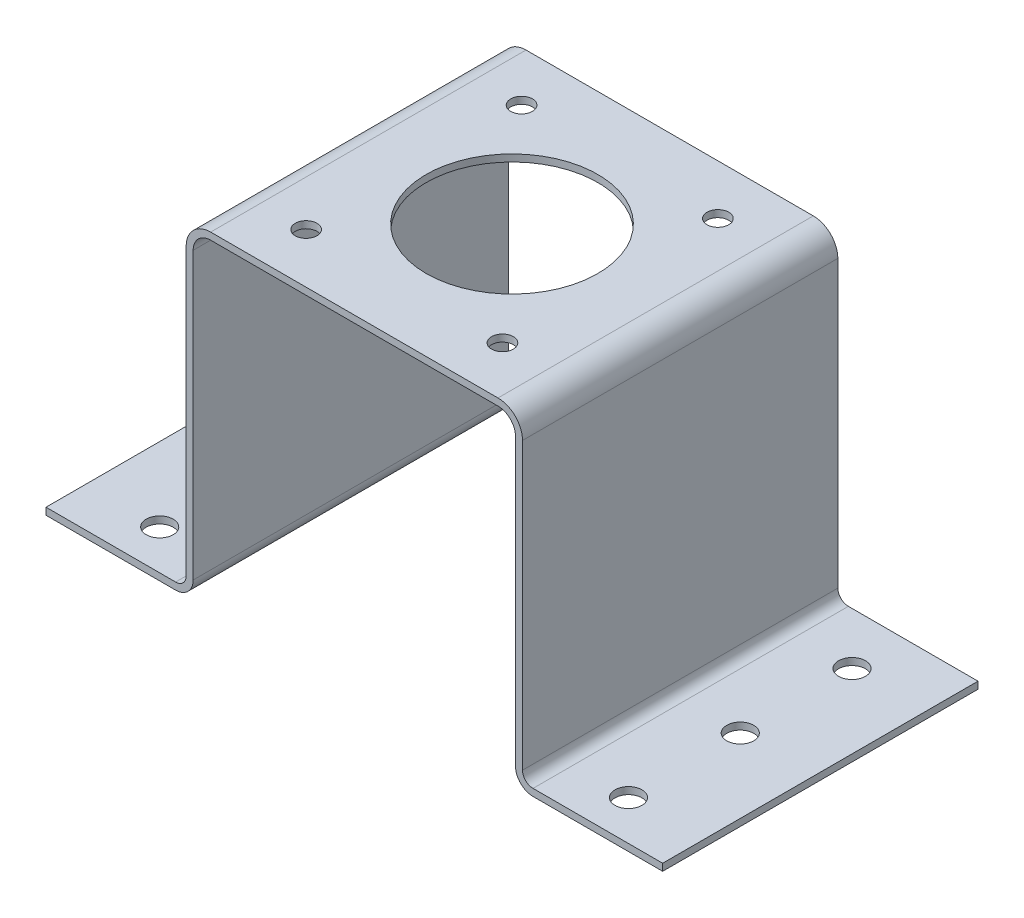
ISO-10303-21;
HEADER;
FILE_DESCRIPTION(('STEP AP214'),'2;1');
FILE_NAME('part.step','',(''),(''),'','','');
FILE_SCHEMA(('AUTOMOTIVE_DESIGN { 1 0 10303 214 1 1 1 1 }'));
ENDSEC;
DATA;
#1=APPLICATION_CONTEXT('core data for automotive mechanical design processes');
#2=APPLICATION_PROTOCOL_DEFINITION('international standard','automotive_design',2000,#1);
#3=PRODUCT_CONTEXT('',#1,'mechanical');
#4=PRODUCT('Part','Part','',(#3));
#5=PRODUCT_RELATED_PRODUCT_CATEGORY('part','',(#4));
#6=PRODUCT_DEFINITION_FORMATION('','',#4);
#7=PRODUCT_DEFINITION_CONTEXT('part definition',#1,'design');
#8=PRODUCT_DEFINITION('design','',#6,#7);
#9=PRODUCT_DEFINITION_SHAPE('','',#8);
#10=(LENGTH_UNIT() NAMED_UNIT(*) SI_UNIT(.MILLI.,.METRE.));
#11=(NAMED_UNIT(*) PLANE_ANGLE_UNIT() SI_UNIT($,.RADIAN.));
#12=(NAMED_UNIT(*) SI_UNIT($,.STERADIAN.) SOLID_ANGLE_UNIT());
#13=UNCERTAINTY_MEASURE_WITH_UNIT(LENGTH_MEASURE(1.E-05),#10,'distance_accuracy_value','');
#14=(GEOMETRIC_REPRESENTATION_CONTEXT(3) GLOBAL_UNCERTAINTY_ASSIGNED_CONTEXT((#13)) GLOBAL_UNIT_ASSIGNED_CONTEXT((#10,
#11,#12)) REPRESENTATION_CONTEXT('',''));
#15=CARTESIAN_POINT('',(0.,0.,0.));
#16=DIRECTION('',(0.,0.,1.));
#17=DIRECTION('',(1.,0.,0.));
#18=AXIS2_PLACEMENT_3D('',#15,#16,#17);
#19=CARTESIAN_POINT('',(18.796,2.54,45.72));
#20=DIRECTION('',(0.,0.,-1.));
#21=DIRECTION('',(-1.,0.,0.));
#22=AXIS2_PLACEMENT_3D('',#19,#20,#21);
#23=CYLINDRICAL_SURFACE('',#22,1.524);
#24=CARTESIAN_POINT('',(18.796,2.54,0.));
#25=DIRECTION('',(0.,0.,1.));
#26=DIRECTION('',(1.,0.,0.));
#27=AXIS2_PLACEMENT_3D('',#24,#25,#26);
#28=CIRCLE('',#27,1.524);
#29=CARTESIAN_POINT('',(18.796,1.016,0.));
#30=VERTEX_POINT('',#29);
#31=CARTESIAN_POINT('',(20.32,2.54000000000001,0.));
#32=VERTEX_POINT('',#31);
#33=EDGE_CURVE('E200',#30,#32,#28,.T.);
#34=ORIENTED_EDGE('',*,*,#33,.F.);
#35=DIRECTION('',(0.,0.,-1.));
#36=VECTOR('',#35,1.);
#37=CARTESIAN_POINT('',(18.796,1.016,45.72));
#38=LINE('',#37,#36);
#39=CARTESIAN_POINT('',(18.796,1.016,45.72));
#40=VERTEX_POINT('',#39);
#41=EDGE_CURVE('E11',#40,#30,#38,.T.);
#42=ORIENTED_EDGE('',*,*,#41,.F.);
#43=CARTESIAN_POINT('',(18.796,2.54,45.72));
#44=DIRECTION('',(0.,0.,1.));
#45=DIRECTION('',(1.,0.,0.));
#46=AXIS2_PLACEMENT_3D('',#43,#44,#45);
#47=CIRCLE('',#46,1.524);
#48=CARTESIAN_POINT('',(20.32,2.54000000000001,45.72));
#49=VERTEX_POINT('',#48);
#50=EDGE_CURVE('E249',#40,#49,#47,.T.);
#51=ORIENTED_EDGE('',*,*,#50,.T.);
#52=DIRECTION('',(0.,0.,-1.));
#53=VECTOR('',#52,1.);
#54=CARTESIAN_POINT('',(20.32,2.54000000000001,45.72));
#55=LINE('',#54,#53);
#56=EDGE_CURVE('E125',#49,#32,#55,.T.);
#57=ORIENTED_EDGE('',*,*,#56,.T.);
#58=EDGE_LOOP('',(#34,#42,#51,#57));
#59=FACE_BOUND('',#58,.T.);
#60=ADVANCED_FACE('F33',(#59),#23,.F.);
#61=CARTESIAN_POINT('',(0.,1.016,45.72));
#62=DIRECTION('',(0.,1.,0.));
#63=DIRECTION('',(0.,0.,1.));
#64=AXIS2_PLACEMENT_3D('',#61,#62,#63);
#65=PLANE('',#64);
#66=CARTESIAN_POINT('',(10.7188,1.016,23.749));
#67=DIRECTION('',(0.,1.,0.));
#68=DIRECTION('',(0.,0.,1.));
#69=AXIS2_PLACEMENT_3D('',#66,#67,#68);
#70=CIRCLE('',#69,1.9558);
#71=CARTESIAN_POINT('',(10.7188,1.016,25.7048));
#72=VERTEX_POINT('',#71);
#73=EDGE_CURVE('E298',#72,#72,#70,.T.);
#74=ORIENTED_EDGE('',*,*,#73,.F.);
#75=EDGE_LOOP('',(#74));
#76=FACE_BOUND('',#75,.T.);
#77=CARTESIAN_POINT('',(10.7188,1.016,39.9542));
#78=DIRECTION('',(0.,1.,0.));
#79=DIRECTION('',(0.,0.,1.));
#80=AXIS2_PLACEMENT_3D('',#77,#78,#79);
#81=CIRCLE('',#80,1.9558);
#82=CARTESIAN_POINT('',(10.7188,1.016,41.91));
#83=VERTEX_POINT('',#82);
#84=EDGE_CURVE('E303',#83,#83,#81,.T.);
#85=ORIENTED_EDGE('',*,*,#84,.F.);
#86=EDGE_LOOP('',(#85));
#87=FACE_BOUND('',#86,.T.);
#88=CARTESIAN_POINT('',(10.7188,1.016,7.5438));
#89=DIRECTION('',(0.,1.,0.));
#90=DIRECTION('',(0.,0.,1.));
#91=AXIS2_PLACEMENT_3D('',#88,#89,#90);
#92=CIRCLE('',#91,1.9558);
#93=CARTESIAN_POINT('',(10.7188,1.016,9.4996));
#94=VERTEX_POINT('',#93);
#95=EDGE_CURVE('E295',#94,#94,#92,.T.);
#96=ORIENTED_EDGE('',*,*,#95,.F.);
#97=EDGE_LOOP('',(#96));
#98=FACE_BOUND('',#97,.T.);
#99=DIRECTION('',(1.,0.,0.));
#100=VECTOR('',#99,1.);
#101=CARTESIAN_POINT('',(0.,1.016,0.));
#102=LINE('',#101,#100);
#103=CARTESIAN_POINT('',(0.,1.016,0.));
#104=VERTEX_POINT('',#103);
#105=EDGE_CURVE('E247',#104,#30,#102,.T.);
#106=ORIENTED_EDGE('',*,*,#105,.F.);
#107=DIRECTION('',(0.,0.,-1.));
#108=VECTOR('',#107,1.);
#109=CARTESIAN_POINT('',(0.,1.016,45.72));
#110=LINE('',#109,#108);
#111=CARTESIAN_POINT('',(0.,1.016,45.72));
#112=VERTEX_POINT('',#111);
#113=EDGE_CURVE('E42',#112,#104,#110,.T.);
#114=ORIENTED_EDGE('',*,*,#113,.F.);
#115=DIRECTION('',(1.,0.,0.));
#116=VECTOR('',#115,1.);
#117=CARTESIAN_POINT('',(0.,1.016,45.72));
#118=LINE('',#117,#116);
#119=EDGE_CURVE('E195',#112,#40,#118,.T.);
#120=ORIENTED_EDGE('',*,*,#119,.T.);
#121=ORIENTED_EDGE('',*,*,#41,.T.);
#122=EDGE_LOOP('',(#106,#114,#120,#121));
#123=FACE_BOUND('',#122,.T.);
#124=ADVANCED_FACE('F449',(#76,#87,#98,#123),#65,.T.);
#125=CARTESIAN_POINT('',(0.,0.,45.72));
#126=DIRECTION('',(-1.,0.,0.));
#127=DIRECTION('',(0.,0.,1.));
#128=AXIS2_PLACEMENT_3D('',#125,#126,#127);
#129=PLANE('',#128);
#130=DIRECTION('',(0.,1.,0.));
#131=VECTOR('',#130,1.);
#132=CARTESIAN_POINT('',(0.,0.,0.));
#133=LINE('',#132,#131);
#134=CARTESIAN_POINT('',(0.,0.,0.));
#135=VERTEX_POINT('',#134);
#136=EDGE_CURVE('E181',#135,#104,#133,.T.);
#137=ORIENTED_EDGE('',*,*,#136,.F.);
#138=DIRECTION('',(0.,0.,-1.));
#139=VECTOR('',#138,1.);
#140=CARTESIAN_POINT('',(0.,0.,45.72));
#141=LINE('',#140,#139);
#142=CARTESIAN_POINT('',(0.,0.,45.72));
#143=VERTEX_POINT('',#142);
#144=EDGE_CURVE('E175',#143,#135,#141,.T.);
#145=ORIENTED_EDGE('',*,*,#144,.F.);
#146=DIRECTION('',(0.,1.,0.));
#147=VECTOR('',#146,1.);
#148=CARTESIAN_POINT('',(0.,0.,45.72));
#149=LINE('',#148,#147);
#150=EDGE_CURVE('E179',#143,#112,#149,.T.);
#151=ORIENTED_EDGE('',*,*,#150,.T.);
#152=ORIENTED_EDGE('',*,*,#113,.T.);
#153=EDGE_LOOP('',(#137,#145,#151,#152));
#154=FACE_BOUND('',#153,.T.);
#155=ADVANCED_FACE('F177',(#154),#129,.T.);
#156=CARTESIAN_POINT('',(0.,0.,45.72));
#157=DIRECTION('',(0.,1.,0.));
#158=DIRECTION('',(0.,0.,1.));
#159=AXIS2_PLACEMENT_3D('',#156,#157,#158);
#160=PLANE('',#159);
#161=CARTESIAN_POINT('',(10.7188,0.,23.749));
#162=DIRECTION('',(0.,1.,0.));
#163=DIRECTION('',(0.,0.,1.));
#164=AXIS2_PLACEMENT_3D('',#161,#162,#163);
#165=CIRCLE('',#164,1.9558);
#166=CARTESIAN_POINT('',(10.7188,0.,25.7048));
#167=VERTEX_POINT('',#166);
#168=EDGE_CURVE('E36',#167,#167,#165,.T.);
#169=ORIENTED_EDGE('',*,*,#168,.T.);
#170=EDGE_LOOP('',(#169));
#171=FACE_BOUND('',#170,.T.);
#172=CARTESIAN_POINT('',(10.7188,0.,39.9542));
#173=DIRECTION('',(0.,1.,0.));
#174=DIRECTION('',(0.,0.,1.));
#175=AXIS2_PLACEMENT_3D('',#172,#173,#174);
#176=CIRCLE('',#175,1.9558);
#177=CARTESIAN_POINT('',(10.7188,0.,41.91));
#178=VERTEX_POINT('',#177);
#179=EDGE_CURVE('E296',#178,#178,#176,.T.);
#180=ORIENTED_EDGE('',*,*,#179,.T.);
#181=EDGE_LOOP('',(#180));
#182=FACE_BOUND('',#181,.T.);
#183=CARTESIAN_POINT('',(10.7188,0.,7.5438));
#184=DIRECTION('',(0.,1.,0.));
#185=DIRECTION('',(0.,0.,1.));
#186=AXIS2_PLACEMENT_3D('',#183,#184,#185);
#187=CIRCLE('',#186,1.9558);
#188=CARTESIAN_POINT('',(10.7188,0.,9.4996));
#189=VERTEX_POINT('',#188);
#190=EDGE_CURVE('E292',#189,#189,#187,.T.);
#191=ORIENTED_EDGE('',*,*,#190,.T.);
#192=EDGE_LOOP('',(#191));
#193=FACE_BOUND('',#192,.T.);
#194=DIRECTION('',(1.,0.,0.));
#195=VECTOR('',#194,1.);
#196=CARTESIAN_POINT('',(0.,0.,0.));
#197=LINE('',#196,#195);
#198=CARTESIAN_POINT('',(18.796,0.,0.));
#199=VERTEX_POINT('',#198);
#200=EDGE_CURVE('E244',#135,#199,#197,.T.);
#201=ORIENTED_EDGE('',*,*,#200,.T.);
#202=DIRECTION('',(0.,0.,-1.));
#203=VECTOR('',#202,1.);
#204=CARTESIAN_POINT('',(18.796,0.,45.72));
#205=LINE('',#204,#203);
#206=CARTESIAN_POINT('',(18.796,0.,45.72));
#207=VERTEX_POINT('',#206);
#208=EDGE_CURVE('E184',#207,#199,#205,.T.);
#209=ORIENTED_EDGE('',*,*,#208,.F.);
#210=DIRECTION('',(1.,0.,0.));
#211=VECTOR('',#210,1.);
#212=CARTESIAN_POINT('',(0.,0.,45.72));
#213=LINE('',#212,#211);
#214=EDGE_CURVE('E187',#143,#207,#213,.T.);
#215=ORIENTED_EDGE('',*,*,#214,.F.);
#216=ORIENTED_EDGE('',*,*,#144,.T.);
#217=EDGE_LOOP('',(#201,#209,#215,#216));
#218=FACE_BOUND('',#217,.T.);
#219=ADVANCED_FACE('F188',(#171,#182,#193,#218),#160,.F.);
#220=CARTESIAN_POINT('',(18.796,2.54,45.72));
#221=DIRECTION('',(0.,0.,-1.));
#222=DIRECTION('',(-1.,0.,0.));
#223=AXIS2_PLACEMENT_3D('',#220,#221,#222);
#224=CYLINDRICAL_SURFACE('',#223,2.54);
#225=CARTESIAN_POINT('',(18.796,2.54,0.));
#226=DIRECTION('',(0.,0.,1.));
#227=DIRECTION('',(1.,0.,0.));
#228=AXIS2_PLACEMENT_3D('',#225,#226,#227);
#229=CIRCLE('',#228,2.54);
#230=CARTESIAN_POINT('',(21.336,2.54000000000002,0.));
#231=VERTEX_POINT('',#230);
#232=EDGE_CURVE('E242',#199,#231,#229,.T.);
#233=ORIENTED_EDGE('',*,*,#232,.T.);
#234=DIRECTION('',(0.,0.,-1.));
#235=VECTOR('',#234,1.);
#236=CARTESIAN_POINT('',(21.336,2.54000000000002,45.72));
#237=LINE('',#236,#235);
#238=CARTESIAN_POINT('',(21.336,2.54000000000002,45.72));
#239=VERTEX_POINT('',#238);
#240=EDGE_CURVE('E253',#239,#231,#237,.T.);
#241=ORIENTED_EDGE('',*,*,#240,.F.);
#242=CARTESIAN_POINT('',(18.796,2.54,45.72));
#243=DIRECTION('',(0.,0.,1.));
#244=DIRECTION('',(1.,0.,0.));
#245=AXIS2_PLACEMENT_3D('',#242,#243,#244);
#246=CIRCLE('',#245,2.54);
#247=EDGE_CURVE('E192',#207,#239,#246,.T.);
#248=ORIENTED_EDGE('',*,*,#247,.F.);
#249=ORIENTED_EDGE('',*,*,#208,.T.);
#250=EDGE_LOOP('',(#233,#241,#248,#249));
#251=FACE_BOUND('',#250,.T.);
#252=ADVANCED_FACE('F383',(#251),#224,.T.);
#253=CARTESIAN_POINT('',(21.336,2.54000000000002,45.72));
#254=DIRECTION('',(-1.,0.,0.));
#255=DIRECTION('',(0.,0.,1.));
#256=AXIS2_PLACEMENT_3D('',#253,#254,#255);
#257=PLANE('',#256);
#258=DIRECTION('',(0.,1.,0.));
#259=VECTOR('',#258,1.);
#260=CARTESIAN_POINT('',(21.336,2.54000000000002,0.));
#261=LINE('',#260,#259);
#262=CARTESIAN_POINT('',(21.336,43.942,0.));
#263=VERTEX_POINT('',#262);
#264=EDGE_CURVE('E240',#231,#263,#261,.T.);
#265=ORIENTED_EDGE('',*,*,#264,.T.);
#266=DIRECTION('',(0.,0.,-1.));
#267=VECTOR('',#266,1.);
#268=CARTESIAN_POINT('',(21.336,43.942,45.72));
#269=LINE('',#268,#267);
#270=CARTESIAN_POINT('',(21.336,43.942,45.72));
#271=VERTEX_POINT('',#270);
#272=EDGE_CURVE('E256',#271,#263,#269,.T.);
#273=ORIENTED_EDGE('',*,*,#272,.F.);
#274=DIRECTION('',(0.,1.,0.));
#275=VECTOR('',#274,1.);
#276=CARTESIAN_POINT('',(21.336,2.54000000000002,45.72));
#277=LINE('',#276,#275);
#278=EDGE_CURVE('E378',#239,#271,#277,.T.);
#279=ORIENTED_EDGE('',*,*,#278,.F.);
#280=ORIENTED_EDGE('',*,*,#240,.T.);
#281=EDGE_LOOP('',(#265,#273,#279,#280));
#282=FACE_BOUND('',#281,.T.);
#283=ADVANCED_FACE('F387',(#282),#257,.F.);
#284=CARTESIAN_POINT('',(23.876,43.942,45.72));
#285=DIRECTION('',(0.,0.,-1.));
#286=DIRECTION('',(-1.,0.,0.));
#287=AXIS2_PLACEMENT_3D('',#284,#285,#286);
#288=CYLINDRICAL_SURFACE('',#287,2.54);
#289=CARTESIAN_POINT('',(23.876,43.942,0.));
#290=DIRECTION('',(0.,0.,-1.));
#291=DIRECTION('',(-1.,0.,0.));
#292=AXIS2_PLACEMENT_3D('',#289,#290,#291);
#293=CIRCLE('',#292,2.54);
#294=CARTESIAN_POINT('',(23.876,46.482,0.));
#295=VERTEX_POINT('',#294);
#296=EDGE_CURVE('E238',#263,#295,#293,.T.);
#297=ORIENTED_EDGE('',*,*,#296,.T.);
#298=DIRECTION('',(0.,0.,-1.));
#299=VECTOR('',#298,1.);
#300=CARTESIAN_POINT('',(23.876,46.482,45.72));
#301=LINE('',#300,#299);
#302=CARTESIAN_POINT('',(23.876,46.482,45.72));
#303=VERTEX_POINT('',#302);
#304=EDGE_CURVE('E259',#303,#295,#301,.T.);
#305=ORIENTED_EDGE('',*,*,#304,.F.);
#306=CARTESIAN_POINT('',(23.876,43.942,45.72));
#307=DIRECTION('',(0.,0.,-1.));
#308=DIRECTION('',(-1.,0.,0.));
#309=AXIS2_PLACEMENT_3D('',#306,#307,#308);
#310=CIRCLE('',#309,2.54);
#311=EDGE_CURVE('E376',#271,#303,#310,.T.);
#312=ORIENTED_EDGE('',*,*,#311,.F.);
#313=ORIENTED_EDGE('',*,*,#272,.T.);
#314=EDGE_LOOP('',(#297,#305,#312,#313));
#315=FACE_BOUND('',#314,.T.);
#316=ADVANCED_FACE('F392',(#315),#288,.F.);
#317=CARTESIAN_POINT('',(23.876,46.482,45.72));
#318=DIRECTION('',(0.,1.,0.));
#319=DIRECTION('',(0.,0.,1.));
#320=AXIS2_PLACEMENT_3D('',#317,#318,#319);
#321=PLANE('',#320);
#322=CARTESIAN_POINT('',(30.471270608649,46.482,7.23871164363917));
#323=DIRECTION('',(0.,1.,0.));
#324=DIRECTION('',(0.,0.,1.));
#325=AXIS2_PLACEMENT_3D('',#322,#323,#324);
#326=CIRCLE('',#325,1.5748);
#327=CARTESIAN_POINT('',(30.471270608649,46.482,8.81351164363918));
#328=VERTEX_POINT('',#327);
#329=EDGE_CURVE('E329',#328,#328,#326,.T.);
#330=ORIENTED_EDGE('',*,*,#329,.T.);
#331=EDGE_LOOP('',(#330));
#332=FACE_BOUND('',#331,.T.);
#333=CARTESIAN_POINT('',(58.936729391351,46.482,38.4812883563608));
#334=DIRECTION('',(0.,1.,0.));
#335=DIRECTION('',(0.,0.,1.));
#336=AXIS2_PLACEMENT_3D('',#333,#334,#335);
#337=CIRCLE('',#336,1.57480000000001);
#338=CARTESIAN_POINT('',(58.936729391351,46.482,40.0560883563608));
#339=VERTEX_POINT('',#338);
#340=EDGE_CURVE('E326',#339,#339,#337,.T.);
#341=ORIENTED_EDGE('',*,*,#340,.T.);
#342=EDGE_LOOP('',(#341));
#343=FACE_BOUND('',#342,.T.);
#344=CARTESIAN_POINT('',(30.471270608649,46.482,38.4812883563608));
#345=DIRECTION('',(0.,1.,0.));
#346=DIRECTION('',(0.,0.,1.));
#347=AXIS2_PLACEMENT_3D('',#344,#345,#346);
#348=CIRCLE('',#347,1.57480000000001);
#349=CARTESIAN_POINT('',(30.471270608649,46.482,40.0560883563608));
#350=VERTEX_POINT('',#349);
#351=EDGE_CURVE('E318',#350,#350,#348,.T.);
#352=ORIENTED_EDGE('',*,*,#351,.T.);
#353=EDGE_LOOP('',(#352));
#354=FACE_BOUND('',#353,.T.);
#355=CARTESIAN_POINT('',(58.936729391351,46.482,7.23871164363917));
#356=DIRECTION('',(0.,1.,0.));
#357=DIRECTION('',(0.,0.,1.));
#358=AXIS2_PLACEMENT_3D('',#355,#356,#357);
#359=CIRCLE('',#358,1.5748);
#360=CARTESIAN_POINT('',(58.936729391351,46.482,8.81351164363918));
#361=VERTEX_POINT('',#360);
#362=EDGE_CURVE('E335',#361,#361,#359,.T.);
#363=ORIENTED_EDGE('',*,*,#362,.T.);
#364=EDGE_LOOP('',(#363));
#365=FACE_BOUND('',#364,.T.);
#366=CARTESIAN_POINT('',(44.704,46.482,22.86));
#367=DIRECTION('',(0.,1.,0.));
#368=DIRECTION('',(0.,0.,1.));
#369=AXIS2_PLACEMENT_3D('',#366,#367,#368);
#370=CIRCLE('',#369,12.446);
#371=CARTESIAN_POINT('',(44.704,46.482,35.306));
#372=VERTEX_POINT('',#371);
#373=EDGE_CURVE('E204',#372,#372,#370,.T.);
#374=ORIENTED_EDGE('',*,*,#373,.T.);
#375=EDGE_LOOP('',(#374));
#376=FACE_BOUND('',#375,.T.);
#377=DIRECTION('',(1.,0.,0.));
#378=VECTOR('',#377,1.);
#379=CARTESIAN_POINT('',(23.876,46.482,0.));
#380=LINE('',#379,#378);
#381=CARTESIAN_POINT('',(65.532,46.482,0.));
#382=VERTEX_POINT('',#381);
#383=EDGE_CURVE('E236',#295,#382,#380,.T.);
#384=ORIENTED_EDGE('',*,*,#383,.T.);
#385=DIRECTION('',(0.,0.,-1.));
#386=VECTOR('',#385,1.);
#387=CARTESIAN_POINT('',(65.532,46.482,45.72));
#388=LINE('',#387,#386);
#389=CARTESIAN_POINT('',(65.532,46.482,45.72));
#390=VERTEX_POINT('',#389);
#391=EDGE_CURVE('E262',#390,#382,#388,.T.);
#392=ORIENTED_EDGE('',*,*,#391,.F.);
#393=DIRECTION('',(1.,0.,0.));
#394=VECTOR('',#393,1.);
#395=CARTESIAN_POINT('',(23.876,46.482,45.72));
#396=LINE('',#395,#394);
#397=EDGE_CURVE('E374',#303,#390,#396,.T.);
#398=ORIENTED_EDGE('',*,*,#397,.F.);
#399=ORIENTED_EDGE('',*,*,#304,.T.);
#400=EDGE_LOOP('',(#384,#392,#398,#399));
#401=FACE_BOUND('',#400,.T.);
#402=ADVANCED_FACE('F398',(#332,#343,#354,#365,#376,#401),#321,.F.);
#403=CARTESIAN_POINT('',(65.532,43.942,45.72));
#404=DIRECTION('',(0.,0.,-1.));
#405=DIRECTION('',(-1.,0.,0.));
#406=AXIS2_PLACEMENT_3D('',#403,#404,#405);
#407=CYLINDRICAL_SURFACE('',#406,2.54);
#408=CARTESIAN_POINT('',(65.532,43.942,0.));
#409=DIRECTION('',(0.,0.,-1.));
#410=DIRECTION('',(-1.,0.,0.));
#411=AXIS2_PLACEMENT_3D('',#408,#409,#410);
#412=CIRCLE('',#411,2.54);
#413=CARTESIAN_POINT('',(68.072,43.942,0.));
#414=VERTEX_POINT('',#413);
#415=EDGE_CURVE('E234',#382,#414,#412,.T.);
#416=ORIENTED_EDGE('',*,*,#415,.T.);
#417=DIRECTION('',(0.,0.,-1.));
#418=VECTOR('',#417,1.);
#419=CARTESIAN_POINT('',(68.072,43.942,45.72));
#420=LINE('',#419,#418);
#421=CARTESIAN_POINT('',(68.072,43.942,45.72));
#422=VERTEX_POINT('',#421);
#423=EDGE_CURVE('E265',#422,#414,#420,.T.);
#424=ORIENTED_EDGE('',*,*,#423,.F.);
#425=CARTESIAN_POINT('',(65.532,43.942,45.72));
#426=DIRECTION('',(0.,0.,-1.));
#427=DIRECTION('',(-1.,0.,0.));
#428=AXIS2_PLACEMENT_3D('',#425,#426,#427);
#429=CIRCLE('',#428,2.54);
#430=EDGE_CURVE('E372',#390,#422,#429,.T.);
#431=ORIENTED_EDGE('',*,*,#430,.F.);
#432=ORIENTED_EDGE('',*,*,#391,.T.);
#433=EDGE_LOOP('',(#416,#424,#431,#432));
#434=FACE_BOUND('',#433,.T.);
#435=ADVANCED_FACE('F402',(#434),#407,.F.);
#436=CARTESIAN_POINT('',(68.072,43.942,45.72));
#437=DIRECTION('',(1.,0.,0.));
#438=DIRECTION('',(0.,0.,-1.));
#439=AXIS2_PLACEMENT_3D('',#436,#437,#438);
#440=PLANE('',#439);
#441=DIRECTION('',(0.,-1.,0.));
#442=VECTOR('',#441,1.);
#443=CARTESIAN_POINT('',(68.072,43.942,0.));
#444=LINE('',#443,#442);
#445=CARTESIAN_POINT('',(68.072,2.54000000000002,0.));
#446=VERTEX_POINT('',#445);
#447=EDGE_CURVE('E232',#414,#446,#444,.T.);
#448=ORIENTED_EDGE('',*,*,#447,.T.);
#449=DIRECTION('',(0.,0.,-1.));
#450=VECTOR('',#449,1.);
#451=CARTESIAN_POINT('',(68.072,2.54000000000002,45.72));
#452=LINE('',#451,#450);
#453=CARTESIAN_POINT('',(68.072,2.54000000000002,45.72));
#454=VERTEX_POINT('',#453);
#455=EDGE_CURVE('E268',#454,#446,#452,.T.);
#456=ORIENTED_EDGE('',*,*,#455,.F.);
#457=DIRECTION('',(0.,-1.,0.));
#458=VECTOR('',#457,1.);
#459=CARTESIAN_POINT('',(68.072,43.942,45.72));
#460=LINE('',#459,#458);
#461=EDGE_CURVE('E370',#422,#454,#460,.T.);
#462=ORIENTED_EDGE('',*,*,#461,.F.);
#463=ORIENTED_EDGE('',*,*,#423,.T.);
#464=EDGE_LOOP('',(#448,#456,#462,#463));
#465=FACE_BOUND('',#464,.T.);
#466=ADVANCED_FACE('F407',(#465),#440,.F.);
#467=CARTESIAN_POINT('',(70.612,2.54,45.72));
#468=DIRECTION('',(0.,0.,-1.));
#469=DIRECTION('',(-1.,0.,0.));
#470=AXIS2_PLACEMENT_3D('',#467,#468,#469);
#471=CYLINDRICAL_SURFACE('',#470,2.54);
#472=CARTESIAN_POINT('',(70.612,2.54,0.));
#473=DIRECTION('',(0.,0.,1.));
#474=DIRECTION('',(1.,0.,0.));
#475=AXIS2_PLACEMENT_3D('',#472,#473,#474);
#476=CIRCLE('',#475,2.54);
#477=CARTESIAN_POINT('',(70.612,0.,0.));
#478=VERTEX_POINT('',#477);
#479=EDGE_CURVE('E230',#446,#478,#476,.T.);
#480=ORIENTED_EDGE('',*,*,#479,.T.);
#481=DIRECTION('',(0.,0.,-1.));
#482=VECTOR('',#481,1.);
#483=CARTESIAN_POINT('',(70.612,0.,45.72));
#484=LINE('',#483,#482);
#485=CARTESIAN_POINT('',(70.612,0.,45.72));
#486=VERTEX_POINT('',#485);
#487=EDGE_CURVE('E271',#486,#478,#484,.T.);
#488=ORIENTED_EDGE('',*,*,#487,.F.);
#489=CARTESIAN_POINT('',(70.612,2.54,45.72));
#490=DIRECTION('',(0.,0.,1.));
#491=DIRECTION('',(1.,0.,0.));
#492=AXIS2_PLACEMENT_3D('',#489,#490,#491);
#493=CIRCLE('',#492,2.54);
#494=EDGE_CURVE('E368',#454,#486,#493,.T.);
#495=ORIENTED_EDGE('',*,*,#494,.F.);
#496=ORIENTED_EDGE('',*,*,#455,.T.);
#497=EDGE_LOOP('',(#480,#488,#495,#496));
#498=FACE_BOUND('',#497,.T.);
#499=ADVANCED_FACE('F413',(#498),#471,.T.);
#500=CARTESIAN_POINT('',(70.612,0.,45.72));
#501=DIRECTION('',(0.,1.,0.));
#502=DIRECTION('',(0.,0.,1.));
#503=AXIS2_PLACEMENT_3D('',#500,#501,#502);
#504=PLANE('',#503);
#505=CARTESIAN_POINT('',(78.6892,0.,23.749));
#506=DIRECTION('',(0.,1.,0.));
#507=DIRECTION('',(0.,0.,1.));
#508=AXIS2_PLACEMENT_3D('',#505,#506,#507);
#509=CIRCLE('',#508,1.9558);
#510=CARTESIAN_POINT('',(78.6892,0.,25.7048));
#511=VERTEX_POINT('',#510);
#512=EDGE_CURVE('E557',#511,#511,#509,.F.);
#513=ORIENTED_EDGE('',*,*,#512,.F.);
#514=EDGE_LOOP('',(#513));
#515=FACE_BOUND('',#514,.T.);
#516=CARTESIAN_POINT('',(78.6892,0.,39.9542));
#517=DIRECTION('',(0.,1.,0.));
#518=DIRECTION('',(0.,0.,1.));
#519=AXIS2_PLACEMENT_3D('',#516,#517,#518);
#520=CIRCLE('',#519,1.9558);
#521=CARTESIAN_POINT('',(78.6892,0.,41.91));
#522=VERTEX_POINT('',#521);
#523=EDGE_CURVE('E559',#522,#522,#520,.F.);
#524=ORIENTED_EDGE('',*,*,#523,.F.);
#525=EDGE_LOOP('',(#524));
#526=FACE_BOUND('',#525,.T.);
#527=CARTESIAN_POINT('',(78.6892,0.,7.5438));
#528=DIRECTION('',(0.,1.,0.));
#529=DIRECTION('',(0.,0.,1.));
#530=AXIS2_PLACEMENT_3D('',#527,#528,#529);
#531=CIRCLE('',#530,1.9558);
#532=CARTESIAN_POINT('',(78.6892,0.,9.4996));
#533=VERTEX_POINT('',#532);
#534=EDGE_CURVE('E308',#533,#533,#531,.F.);
#535=ORIENTED_EDGE('',*,*,#534,.F.);
#536=EDGE_LOOP('',(#535));
#537=FACE_BOUND('',#536,.T.);
#538=DIRECTION('',(1.,0.,0.));
#539=VECTOR('',#538,1.);
#540=CARTESIAN_POINT('',(70.612,0.,0.));
#541=LINE('',#540,#539);
#542=CARTESIAN_POINT('',(89.408,0.,0.));
#543=VERTEX_POINT('',#542);
#544=EDGE_CURVE('E228',#478,#543,#541,.T.);
#545=ORIENTED_EDGE('',*,*,#544,.T.);
#546=DIRECTION('',(0.,0.,-1.));
#547=VECTOR('',#546,1.);
#548=CARTESIAN_POINT('',(89.408,0.,45.72));
#549=LINE('',#548,#547);
#550=CARTESIAN_POINT('',(89.408,0.,45.72));
#551=VERTEX_POINT('',#550);
#552=EDGE_CURVE('E274',#551,#543,#549,.T.);
#553=ORIENTED_EDGE('',*,*,#552,.F.);
#554=DIRECTION('',(1.,0.,0.));
#555=VECTOR('',#554,1.);
#556=CARTESIAN_POINT('',(70.612,0.,45.72));
#557=LINE('',#556,#555);
#558=EDGE_CURVE('E366',#486,#551,#557,.T.);
#559=ORIENTED_EDGE('',*,*,#558,.F.);
#560=ORIENTED_EDGE('',*,*,#487,.T.);
#561=EDGE_LOOP('',(#545,#553,#559,#560));
#562=FACE_BOUND('',#561,.T.);
#563=ADVANCED_FACE('F417',(#515,#526,#537,#562),#504,.F.);
#564=CARTESIAN_POINT('',(89.408,0.,45.72));
#565=DIRECTION('',(-1.,0.,0.));
#566=DIRECTION('',(0.,0.,1.));
#567=AXIS2_PLACEMENT_3D('',#564,#565,#566);
#568=PLANE('',#567);
#569=DIRECTION('',(0.,1.,0.));
#570=VECTOR('',#569,1.);
#571=CARTESIAN_POINT('',(89.408,0.,0.));
#572=LINE('',#571,#570);
#573=CARTESIAN_POINT('',(89.408,1.016,0.));
#574=VERTEX_POINT('',#573);
#575=EDGE_CURVE('E225',#543,#574,#572,.T.);
#576=ORIENTED_EDGE('',*,*,#575,.T.);
#577=DIRECTION('',(0.,0.,-1.));
#578=VECTOR('',#577,1.);
#579=CARTESIAN_POINT('',(89.408,1.016,45.72));
#580=LINE('',#579,#578);
#581=CARTESIAN_POINT('',(89.408,1.016,45.72));
#582=VERTEX_POINT('',#581);
#583=EDGE_CURVE('E277',#582,#574,#580,.T.);
#584=ORIENTED_EDGE('',*,*,#583,.F.);
#585=DIRECTION('',(0.,1.,0.));
#586=VECTOR('',#585,1.);
#587=CARTESIAN_POINT('',(89.408,0.,45.72));
#588=LINE('',#587,#586);
#589=EDGE_CURVE('E364',#551,#582,#588,.T.);
#590=ORIENTED_EDGE('',*,*,#589,.F.);
#591=ORIENTED_EDGE('',*,*,#552,.T.);
#592=EDGE_LOOP('',(#576,#584,#590,#591));
#593=FACE_BOUND('',#592,.T.);
#594=ADVANCED_FACE('F422',(#593),#568,.F.);
#595=CARTESIAN_POINT('',(70.612,1.016,45.72));
#596=DIRECTION('',(0.,1.,0.));
#597=DIRECTION('',(-1.,0.,0.));
#598=AXIS2_PLACEMENT_3D('',#595,#596,#597);
#599=PLANE('',#598);
#600=CARTESIAN_POINT('',(78.6892,1.016,23.749));
#601=DIRECTION('',(0.,-1.,0.));
#602=DIRECTION('',(0.,0.,1.));
#603=AXIS2_PLACEMENT_3D('',#600,#601,#602);
#604=CIRCLE('',#603,1.9558);
#605=CARTESIAN_POINT('',(78.6892,1.016,25.7048));
#606=VERTEX_POINT('',#605);
#607=EDGE_CURVE('E554',#606,#606,#604,.T.);
#608=ORIENTED_EDGE('',*,*,#607,.T.);
#609=EDGE_LOOP('',(#608));
#610=FACE_BOUND('',#609,.T.);
#611=CARTESIAN_POINT('',(78.6892,1.016,39.9542));
#612=DIRECTION('',(0.,-1.,0.));
#613=DIRECTION('',(0.,0.,1.));
#614=AXIS2_PLACEMENT_3D('',#611,#612,#613);
#615=CIRCLE('',#614,1.9558);
#616=CARTESIAN_POINT('',(78.6892,1.016,41.91));
#617=VERTEX_POINT('',#616);
#618=EDGE_CURVE('E565',#617,#617,#615,.T.);
#619=ORIENTED_EDGE('',*,*,#618,.T.);
#620=EDGE_LOOP('',(#619));
#621=FACE_BOUND('',#620,.T.);
#622=CARTESIAN_POINT('',(78.6892,1.016,7.5438));
#623=DIRECTION('',(0.,-1.,0.));
#624=DIRECTION('',(0.,0.,1.));
#625=AXIS2_PLACEMENT_3D('',#622,#623,#624);
#626=CIRCLE('',#625,1.9558);
#627=CARTESIAN_POINT('',(78.6892,1.016,9.4996));
#628=VERTEX_POINT('',#627);
#629=EDGE_CURVE('E558',#628,#628,#626,.T.);
#630=ORIENTED_EDGE('',*,*,#629,.T.);
#631=EDGE_LOOP('',(#630));
#632=FACE_BOUND('',#631,.T.);
#633=DIRECTION('',(1.,0.,0.));
#634=VECTOR('',#633,1.);
#635=CARTESIAN_POINT('',(70.612,1.016,0.));
#636=LINE('',#635,#634);
#637=CARTESIAN_POINT('',(70.612,1.016,0.));
#638=VERTEX_POINT('',#637);
#639=EDGE_CURVE('E222',#638,#574,#636,.T.);
#640=ORIENTED_EDGE('',*,*,#639,.F.);
#641=DIRECTION('',(0.,0.,-1.));
#642=VECTOR('',#641,1.);
#643=CARTESIAN_POINT('',(70.612,1.016,45.72));
#644=LINE('',#643,#642);
#645=CARTESIAN_POINT('',(70.612,1.016,45.72));
#646=VERTEX_POINT('',#645);
#647=EDGE_CURVE('E279',#646,#638,#644,.T.);
#648=ORIENTED_EDGE('',*,*,#647,.F.);
#649=DIRECTION('',(1.,0.,0.));
#650=VECTOR('',#649,1.);
#651=CARTESIAN_POINT('',(70.612,1.016,45.72));
#652=LINE('',#651,#650);
#653=EDGE_CURVE('E361',#646,#582,#652,.T.);
#654=ORIENTED_EDGE('',*,*,#653,.T.);
#655=ORIENTED_EDGE('',*,*,#583,.T.);
#656=EDGE_LOOP('',(#640,#648,#654,#655));
#657=FACE_BOUND('',#656,.T.);
#658=ADVANCED_FACE('F485',(#610,#621,#632,#657),#599,.T.);
#659=CARTESIAN_POINT('',(70.612,2.54,45.72));
#660=DIRECTION('',(0.,0.,-1.));
#661=DIRECTION('',(-1.,0.,0.));
#662=AXIS2_PLACEMENT_3D('',#659,#660,#661);
#663=CYLINDRICAL_SURFACE('',#662,1.524);
#664=CARTESIAN_POINT('',(70.612,2.54,0.));
#665=DIRECTION('',(0.,0.,1.));
#666=DIRECTION('',(1.,0.,0.));
#667=AXIS2_PLACEMENT_3D('',#664,#665,#666);
#668=CIRCLE('',#667,1.524);
#669=CARTESIAN_POINT('',(69.088,2.54000000000002,0.));
#670=VERTEX_POINT('',#669);
#671=EDGE_CURVE('E219',#670,#638,#668,.T.);
#672=ORIENTED_EDGE('',*,*,#671,.F.);
#673=DIRECTION('',(0.,0.,-1.));
#674=VECTOR('',#673,1.);
#675=CARTESIAN_POINT('',(69.088,2.54000000000002,45.72));
#676=LINE('',#675,#674);
#677=CARTESIAN_POINT('',(69.088,2.54000000000002,45.72));
#678=VERTEX_POINT('',#677);
#679=EDGE_CURVE('E281',#678,#670,#676,.T.);
#680=ORIENTED_EDGE('',*,*,#679,.F.);
#681=CARTESIAN_POINT('',(70.612,2.54,45.72));
#682=DIRECTION('',(0.,0.,1.));
#683=DIRECTION('',(1.,0.,0.));
#684=AXIS2_PLACEMENT_3D('',#681,#682,#683);
#685=CIRCLE('',#684,1.524);
#686=EDGE_CURVE('E358',#678,#646,#685,.T.);
#687=ORIENTED_EDGE('',*,*,#686,.T.);
#688=ORIENTED_EDGE('',*,*,#647,.T.);
#689=EDGE_LOOP('',(#672,#680,#687,#688));
#690=FACE_BOUND('',#689,.T.);
#691=ADVANCED_FACE('F429',(#690),#663,.F.);
#692=CARTESIAN_POINT('',(69.088,43.942,45.72));
#693=DIRECTION('',(1.,0.,0.));
#694=DIRECTION('',(0.,0.,-1.));
#695=AXIS2_PLACEMENT_3D('',#692,#693,#694);
#696=PLANE('',#695);
#697=DIRECTION('',(0.,-1.,0.));
#698=VECTOR('',#697,1.);
#699=CARTESIAN_POINT('',(69.088,43.942,0.));
#700=LINE('',#699,#698);
#701=CARTESIAN_POINT('',(69.088,43.942,0.));
#702=VERTEX_POINT('',#701);
#703=EDGE_CURVE('E216',#702,#670,#700,.T.);
#704=ORIENTED_EDGE('',*,*,#703,.F.);
#705=DIRECTION('',(0.,0.,-1.));
#706=VECTOR('',#705,1.);
#707=CARTESIAN_POINT('',(69.088,43.942,45.72));
#708=LINE('',#707,#706);
#709=CARTESIAN_POINT('',(69.088,43.942,45.72));
#710=VERTEX_POINT('',#709);
#711=EDGE_CURVE('E283',#710,#702,#708,.T.);
#712=ORIENTED_EDGE('',*,*,#711,.F.);
#713=DIRECTION('',(0.,-1.,0.));
#714=VECTOR('',#713,1.);
#715=CARTESIAN_POINT('',(69.088,43.942,45.72));
#716=LINE('',#715,#714);
#717=EDGE_CURVE('E355',#710,#678,#716,.T.);
#718=ORIENTED_EDGE('',*,*,#717,.T.);
#719=ORIENTED_EDGE('',*,*,#679,.T.);
#720=EDGE_LOOP('',(#704,#712,#718,#719));
#721=FACE_BOUND('',#720,.T.);
#722=ADVANCED_FACE('F433',(#721),#696,.T.);
#723=CARTESIAN_POINT('',(65.532,43.942,45.72));
#724=DIRECTION('',(0.,0.,-1.));
#725=DIRECTION('',(-1.,0.,0.));
#726=AXIS2_PLACEMENT_3D('',#723,#724,#725);
#727=CYLINDRICAL_SURFACE('',#726,3.556);
#728=CARTESIAN_POINT('',(65.532,43.942,0.));
#729=DIRECTION('',(0.,0.,-1.));
#730=DIRECTION('',(-1.,0.,0.));
#731=AXIS2_PLACEMENT_3D('',#728,#729,#730);
#732=CIRCLE('',#731,3.556);
#733=CARTESIAN_POINT('',(65.532,47.498,0.));
#734=VERTEX_POINT('',#733);
#735=EDGE_CURVE('E213',#734,#702,#732,.T.);
#736=ORIENTED_EDGE('',*,*,#735,.F.);
#737=DIRECTION('',(0.,0.,-1.));
#738=VECTOR('',#737,1.);
#739=CARTESIAN_POINT('',(65.532,47.498,45.72));
#740=LINE('',#739,#738);
#741=CARTESIAN_POINT('',(65.532,47.498,45.72));
#742=VERTEX_POINT('',#741);
#743=EDGE_CURVE('E285',#742,#734,#740,.T.);
#744=ORIENTED_EDGE('',*,*,#743,.F.);
#745=CARTESIAN_POINT('',(65.532,43.942,45.72));
#746=DIRECTION('',(0.,0.,-1.));
#747=DIRECTION('',(-1.,0.,0.));
#748=AXIS2_PLACEMENT_3D('',#745,#746,#747);
#749=CIRCLE('',#748,3.556);
#750=EDGE_CURVE('E352',#742,#710,#749,.T.);
#751=ORIENTED_EDGE('',*,*,#750,.T.);
#752=ORIENTED_EDGE('',*,*,#711,.T.);
#753=EDGE_LOOP('',(#736,#744,#751,#752));
#754=FACE_BOUND('',#753,.T.);
#755=ADVANCED_FACE('F438',(#754),#727,.T.);
#756=CARTESIAN_POINT('',(23.876,47.498,45.72));
#757=DIRECTION('',(0.,1.,0.));
#758=DIRECTION('',(0.,0.,1.));
#759=AXIS2_PLACEMENT_3D('',#756,#757,#758);
#760=PLANE('',#759);
#761=CARTESIAN_POINT('',(30.471270608649,47.498,7.23871164363917));
#762=DIRECTION('',(0.,1.,0.));
#763=DIRECTION('',(0.,0.,-1.));
#764=AXIS2_PLACEMENT_3D('',#761,#762,#763);
#765=CIRCLE('',#764,1.5748);
#766=CARTESIAN_POINT('',(30.471270608649,47.498,5.66391164363917));
#767=VERTEX_POINT('',#766);
#768=EDGE_CURVE('E315',#767,#767,#765,.T.);
#769=ORIENTED_EDGE('',*,*,#768,.F.);
#770=EDGE_LOOP('',(#769));
#771=FACE_BOUND('',#770,.T.);
#772=CARTESIAN_POINT('',(58.936729391351,47.498,38.4812883563608));
#773=DIRECTION('',(0.,1.,0.));
#774=DIRECTION('',(0.,0.,-1.));
#775=AXIS2_PLACEMENT_3D('',#772,#773,#774);
#776=CIRCLE('',#775,1.57480000000001);
#777=CARTESIAN_POINT('',(58.936729391351,47.498,36.9064883563608));
#778=VERTEX_POINT('',#777);
#779=EDGE_CURVE('E319',#778,#778,#776,.T.);
#780=ORIENTED_EDGE('',*,*,#779,.F.);
#781=EDGE_LOOP('',(#780));
#782=FACE_BOUND('',#781,.T.);
#783=CARTESIAN_POINT('',(30.471270608649,47.498,38.4812883563608));
#784=DIRECTION('',(0.,1.,0.));
#785=DIRECTION('',(0.,0.,1.));
#786=AXIS2_PLACEMENT_3D('',#783,#784,#785);
#787=CIRCLE('',#786,1.57480000000001);
#788=CARTESIAN_POINT('',(30.471270608649,47.498,40.0560883563608));
#789=VERTEX_POINT('',#788);
#790=EDGE_CURVE('E294',#789,#789,#787,.T.);
#791=ORIENTED_EDGE('',*,*,#790,.F.);
#792=EDGE_LOOP('',(#791));
#793=FACE_BOUND('',#792,.T.);
#794=CARTESIAN_POINT('',(58.936729391351,47.498,7.23871164363917));
#795=DIRECTION('',(0.,1.,0.));
#796=DIRECTION('',(0.,0.,1.));
#797=AXIS2_PLACEMENT_3D('',#794,#795,#796);
#798=CIRCLE('',#797,1.5748);
#799=CARTESIAN_POINT('',(58.936729391351,47.498,8.81351164363918));
#800=VERTEX_POINT('',#799);
#801=EDGE_CURVE('E332',#800,#800,#798,.T.);
#802=ORIENTED_EDGE('',*,*,#801,.F.);
#803=EDGE_LOOP('',(#802));
#804=FACE_BOUND('',#803,.T.);
#805=CARTESIAN_POINT('',(44.704,47.498,22.86));
#806=DIRECTION('',(0.,1.,0.));
#807=DIRECTION('',(0.,0.,1.));
#808=AXIS2_PLACEMENT_3D('',#805,#806,#807);
#809=CIRCLE('',#808,12.446);
#810=CARTESIAN_POINT('',(44.704,47.498,35.306));
#811=VERTEX_POINT('',#810);
#812=EDGE_CURVE('E338',#811,#811,#809,.T.);
#813=ORIENTED_EDGE('',*,*,#812,.F.);
#814=EDGE_LOOP('',(#813));
#815=FACE_BOUND('',#814,.T.);
#816=DIRECTION('',(1.,0.,0.));
#817=VECTOR('',#816,1.);
#818=CARTESIAN_POINT('',(23.876,47.498,0.));
#819=LINE('',#818,#817);
#820=CARTESIAN_POINT('',(23.876,47.498,0.));
#821=VERTEX_POINT('',#820);
#822=EDGE_CURVE('E210',#821,#734,#819,.T.);
#823=ORIENTED_EDGE('',*,*,#822,.F.);
#824=DIRECTION('',(0.,0.,-1.));
#825=VECTOR('',#824,1.);
#826=CARTESIAN_POINT('',(23.876,47.498,45.72));
#827=LINE('',#826,#825);
#828=CARTESIAN_POINT('',(23.876,47.498,45.72));
#829=VERTEX_POINT('',#828);
#830=EDGE_CURVE('E287',#829,#821,#827,.T.);
#831=ORIENTED_EDGE('',*,*,#830,.F.);
#832=DIRECTION('',(1.,0.,0.));
#833=VECTOR('',#832,1.);
#834=CARTESIAN_POINT('',(23.876,47.498,45.72));
#835=LINE('',#834,#833);
#836=EDGE_CURVE('E349',#829,#742,#835,.T.);
#837=ORIENTED_EDGE('',*,*,#836,.T.);
#838=ORIENTED_EDGE('',*,*,#743,.T.);
#839=EDGE_LOOP('',(#823,#831,#837,#838));
#840=FACE_BOUND('',#839,.T.);
#841=ADVANCED_FACE('F441',(#771,#782,#793,#804,#815,#840),#760,.T.);
#842=CARTESIAN_POINT('',(23.876,43.942,45.72));
#843=DIRECTION('',(0.,0.,-1.));
#844=DIRECTION('',(-1.,0.,0.));
#845=AXIS2_PLACEMENT_3D('',#842,#843,#844);
#846=CYLINDRICAL_SURFACE('',#845,3.556);
#847=CARTESIAN_POINT('',(23.876,43.942,0.));
#848=DIRECTION('',(0.,0.,-1.));
#849=DIRECTION('',(-1.,0.,0.));
#850=AXIS2_PLACEMENT_3D('',#847,#848,#849);
#851=CIRCLE('',#850,3.556);
#852=CARTESIAN_POINT('',(20.32,43.942,0.));
#853=VERTEX_POINT('',#852);
#854=EDGE_CURVE('E207',#853,#821,#851,.T.);
#855=ORIENTED_EDGE('',*,*,#854,.F.);
#856=DIRECTION('',(0.,0.,-1.));
#857=VECTOR('',#856,1.);
#858=CARTESIAN_POINT('',(20.32,43.942,45.72));
#859=LINE('',#858,#857);
#860=CARTESIAN_POINT('',(20.32,43.942,45.72));
#861=VERTEX_POINT('',#860);
#862=EDGE_CURVE('E289',#861,#853,#859,.T.);
#863=ORIENTED_EDGE('',*,*,#862,.F.);
#864=CARTESIAN_POINT('',(23.876,43.942,45.72));
#865=DIRECTION('',(0.,0.,-1.));
#866=DIRECTION('',(-1.,0.,0.));
#867=AXIS2_PLACEMENT_3D('',#864,#865,#866);
#868=CIRCLE('',#867,3.556);
#869=EDGE_CURVE('E346',#861,#829,#868,.T.);
#870=ORIENTED_EDGE('',*,*,#869,.T.);
#871=ORIENTED_EDGE('',*,*,#830,.T.);
#872=EDGE_LOOP('',(#855,#863,#870,#871));
#873=FACE_BOUND('',#872,.T.);
#874=ADVANCED_FACE('F445',(#873),#846,.T.);
#875=CARTESIAN_POINT('',(20.32,2.54000000000001,45.72));
#876=DIRECTION('',(-1.,0.,0.));
#877=DIRECTION('',(0.,0.,1.));
#878=AXIS2_PLACEMENT_3D('',#875,#876,#877);
#879=PLANE('',#878);
#880=DIRECTION('',(0.,1.,0.));
#881=VECTOR('',#880,1.);
#882=CARTESIAN_POINT('',(20.32,2.54000000000001,0.));
#883=LINE('',#882,#881);
#884=EDGE_CURVE('E203',#32,#853,#883,.T.);
#885=ORIENTED_EDGE('',*,*,#884,.F.);
#886=ORIENTED_EDGE('',*,*,#56,.F.);
#887=DIRECTION('',(0.,1.,0.));
#888=VECTOR('',#887,1.);
#889=CARTESIAN_POINT('',(20.32,2.54000000000001,45.72));
#890=LINE('',#889,#888);
#891=EDGE_CURVE('E344',#49,#861,#890,.T.);
#892=ORIENTED_EDGE('',*,*,#891,.T.);
#893=ORIENTED_EDGE('',*,*,#862,.T.);
#894=EDGE_LOOP('',(#885,#886,#892,#893));
#895=FACE_BOUND('',#894,.T.);
#896=ADVANCED_FACE('F446',(#895),#879,.T.);
#897=CARTESIAN_POINT('',(18.796,2.54,45.72));
#898=DIRECTION('',(0.,0.,1.));
#899=DIRECTION('',(1.,0.,0.));
#900=AXIS2_PLACEMENT_3D('',#897,#898,#899);
#901=PLANE('',#900);
#902=ORIENTED_EDGE('',*,*,#50,.F.);
#903=ORIENTED_EDGE('',*,*,#119,.F.);
#904=ORIENTED_EDGE('',*,*,#150,.F.);
#905=ORIENTED_EDGE('',*,*,#214,.T.);
#906=ORIENTED_EDGE('',*,*,#247,.T.);
#907=ORIENTED_EDGE('',*,*,#278,.T.);
#908=ORIENTED_EDGE('',*,*,#311,.T.);
#909=ORIENTED_EDGE('',*,*,#397,.T.);
#910=ORIENTED_EDGE('',*,*,#430,.T.);
#911=ORIENTED_EDGE('',*,*,#461,.T.);
#912=ORIENTED_EDGE('',*,*,#494,.T.);
#913=ORIENTED_EDGE('',*,*,#558,.T.);
#914=ORIENTED_EDGE('',*,*,#589,.T.);
#915=ORIENTED_EDGE('',*,*,#653,.F.);
#916=ORIENTED_EDGE('',*,*,#686,.F.);
#917=ORIENTED_EDGE('',*,*,#717,.F.);
#918=ORIENTED_EDGE('',*,*,#750,.F.);
#919=ORIENTED_EDGE('',*,*,#836,.F.);
#920=ORIENTED_EDGE('',*,*,#869,.F.);
#921=ORIENTED_EDGE('',*,*,#891,.F.);
#922=EDGE_LOOP('',(#902,#903,#904,#905,#906,#907,#908,#909,#910,#911,#912,#913,#914,#915,#916,
#917,#918,#919,#920,#921));
#923=FACE_BOUND('',#922,.T.);
#924=ADVANCED_FACE('F194',(#923),#901,.T.);
#925=CARTESIAN_POINT('',(18.796,2.54,0.));
#926=DIRECTION('',(0.,0.,1.));
#927=DIRECTION('',(1.,0.,0.));
#928=AXIS2_PLACEMENT_3D('',#925,#926,#927);
#929=PLANE('',#928);
#930=ORIENTED_EDGE('',*,*,#33,.T.);
#931=ORIENTED_EDGE('',*,*,#884,.T.);
#932=ORIENTED_EDGE('',*,*,#854,.T.);
#933=ORIENTED_EDGE('',*,*,#822,.T.);
#934=ORIENTED_EDGE('',*,*,#735,.T.);
#935=ORIENTED_EDGE('',*,*,#703,.T.);
#936=ORIENTED_EDGE('',*,*,#671,.T.);
#937=ORIENTED_EDGE('',*,*,#639,.T.);
#938=ORIENTED_EDGE('',*,*,#575,.F.);
#939=ORIENTED_EDGE('',*,*,#544,.F.);
#940=ORIENTED_EDGE('',*,*,#479,.F.);
#941=ORIENTED_EDGE('',*,*,#447,.F.);
#942=ORIENTED_EDGE('',*,*,#415,.F.);
#943=ORIENTED_EDGE('',*,*,#383,.F.);
#944=ORIENTED_EDGE('',*,*,#296,.F.);
#945=ORIENTED_EDGE('',*,*,#264,.F.);
#946=ORIENTED_EDGE('',*,*,#232,.F.);
#947=ORIENTED_EDGE('',*,*,#200,.F.);
#948=ORIENTED_EDGE('',*,*,#136,.T.);
#949=ORIENTED_EDGE('',*,*,#105,.T.);
#950=EDGE_LOOP('',(#930,#931,#932,#933,#934,#935,#936,#937,#938,#939,#940,#941,#942,#943,#944,
#945,#946,#947,#948,#949));
#951=FACE_BOUND('',#950,.T.);
#952=ADVANCED_FACE('F448',(#951),#929,.F.);
#953=CARTESIAN_POINT('',(44.704,0.,22.86));
#954=DIRECTION('',(0.,1.,0.));
#955=DIRECTION('',(0.,0.,1.));
#956=AXIS2_PLACEMENT_3D('',#953,#954,#955);
#957=CYLINDRICAL_SURFACE('',#956,12.446);
#958=ORIENTED_EDGE('',*,*,#812,.T.);
#959=EDGE_LOOP('',(#958));
#960=FACE_BOUND('',#959,.T.);
#961=ORIENTED_EDGE('',*,*,#373,.F.);
#962=EDGE_LOOP('',(#961));
#963=FACE_BOUND('',#962,.T.);
#964=ADVANCED_FACE('F506',(#960,#963),#957,.F.);
#965=CARTESIAN_POINT('',(58.936729391351,0.,7.23871164363917));
#966=DIRECTION('',(0.,1.,0.));
#967=DIRECTION('',(0.,0.,1.));
#968=AXIS2_PLACEMENT_3D('',#965,#966,#967);
#969=CYLINDRICAL_SURFACE('',#968,1.5748);
#970=ORIENTED_EDGE('',*,*,#801,.T.);
#971=EDGE_LOOP('',(#970));
#972=FACE_BOUND('',#971,.T.);
#973=ORIENTED_EDGE('',*,*,#362,.F.);
#974=EDGE_LOOP('',(#973));
#975=FACE_BOUND('',#974,.T.);
#976=ADVANCED_FACE('F510',(#972,#975),#969,.F.);
#977=CARTESIAN_POINT('',(30.471270608649,0.,38.4812883563608));
#978=DIRECTION('',(0.,1.,0.));
#979=DIRECTION('',(0.,0.,1.));
#980=AXIS2_PLACEMENT_3D('',#977,#978,#979);
#981=CYLINDRICAL_SURFACE('',#980,1.57480000000001);
#982=ORIENTED_EDGE('',*,*,#790,.T.);
#983=EDGE_LOOP('',(#982));
#984=FACE_BOUND('',#983,.T.);
#985=ORIENTED_EDGE('',*,*,#351,.F.);
#986=EDGE_LOOP('',(#985));
#987=FACE_BOUND('',#986,.T.);
#988=ADVANCED_FACE('F514',(#984,#987),#981,.F.);
#989=CARTESIAN_POINT('',(58.936729391351,0.,38.4812883563608));
#990=DIRECTION('',(0.,1.,0.));
#991=DIRECTION('',(0.,0.,1.));
#992=AXIS2_PLACEMENT_3D('',#989,#990,#991);
#993=CYLINDRICAL_SURFACE('',#992,1.57480000000001);
#994=ORIENTED_EDGE('',*,*,#779,.T.);
#995=EDGE_LOOP('',(#994));
#996=FACE_BOUND('',#995,.T.);
#997=ORIENTED_EDGE('',*,*,#340,.F.);
#998=EDGE_LOOP('',(#997));
#999=FACE_BOUND('',#998,.T.);
#1000=ADVANCED_FACE('F518',(#996,#999),#993,.F.);
#1001=CARTESIAN_POINT('',(30.471270608649,0.,7.23871164363917));
#1002=DIRECTION('',(0.,1.,0.));
#1003=DIRECTION('',(0.,0.,1.));
#1004=AXIS2_PLACEMENT_3D('',#1001,#1002,#1003);
#1005=CYLINDRICAL_SURFACE('',#1004,1.5748);
#1006=ORIENTED_EDGE('',*,*,#768,.T.);
#1007=EDGE_LOOP('',(#1006));
#1008=FACE_BOUND('',#1007,.T.);
#1009=ORIENTED_EDGE('',*,*,#329,.F.);
#1010=EDGE_LOOP('',(#1009));
#1011=FACE_BOUND('',#1010,.T.);
#1012=ADVANCED_FACE('F522',(#1008,#1011),#1005,.F.);
#1013=CARTESIAN_POINT('',(10.7188,-44.704,7.5438));
#1014=DIRECTION('',(0.,1.,0.));
#1015=DIRECTION('',(0.,0.,1.));
#1016=AXIS2_PLACEMENT_3D('',#1013,#1014,#1015);
#1017=CYLINDRICAL_SURFACE('',#1016,1.9558);
#1018=ORIENTED_EDGE('',*,*,#95,.T.);
#1019=EDGE_LOOP('',(#1018));
#1020=FACE_BOUND('',#1019,.T.);
#1021=ORIENTED_EDGE('',*,*,#190,.F.);
#1022=EDGE_LOOP('',(#1021));
#1023=FACE_BOUND('',#1022,.T.);
#1024=ADVANCED_FACE('F526',(#1020,#1023),#1017,.F.);
#1025=CARTESIAN_POINT('',(10.7188,-44.704,39.9542));
#1026=DIRECTION('',(0.,1.,0.));
#1027=DIRECTION('',(0.,0.,1.));
#1028=AXIS2_PLACEMENT_3D('',#1025,#1026,#1027);
#1029=CYLINDRICAL_SURFACE('',#1028,1.9558);
#1030=ORIENTED_EDGE('',*,*,#84,.T.);
#1031=EDGE_LOOP('',(#1030));
#1032=FACE_BOUND('',#1031,.T.);
#1033=ORIENTED_EDGE('',*,*,#179,.F.);
#1034=EDGE_LOOP('',(#1033));
#1035=FACE_BOUND('',#1034,.T.);
#1036=ADVANCED_FACE('F530',(#1032,#1035),#1029,.F.);
#1037=CARTESIAN_POINT('',(10.7188,-44.704,23.749));
#1038=DIRECTION('',(0.,1.,0.));
#1039=DIRECTION('',(0.,0.,1.));
#1040=AXIS2_PLACEMENT_3D('',#1037,#1038,#1039);
#1041=CYLINDRICAL_SURFACE('',#1040,1.9558);
#1042=ORIENTED_EDGE('',*,*,#73,.T.);
#1043=EDGE_LOOP('',(#1042));
#1044=FACE_BOUND('',#1043,.T.);
#1045=ORIENTED_EDGE('',*,*,#168,.F.);
#1046=EDGE_LOOP('',(#1045));
#1047=FACE_BOUND('',#1046,.T.);
#1048=ADVANCED_FACE('F534',(#1044,#1047),#1041,.F.);
#1049=CARTESIAN_POINT('',(78.6892,-44.704,7.5438));
#1050=DIRECTION('',(0.,1.,0.));
#1051=DIRECTION('',(0.,0.,1.));
#1052=AXIS2_PLACEMENT_3D('',#1049,#1050,#1051);
#1053=CYLINDRICAL_SURFACE('',#1052,1.9558);
#1054=ORIENTED_EDGE('',*,*,#629,.F.);
#1055=EDGE_LOOP('',(#1054));
#1056=FACE_BOUND('',#1055,.T.);
#1057=ORIENTED_EDGE('',*,*,#534,.T.);
#1058=EDGE_LOOP('',(#1057));
#1059=FACE_BOUND('',#1058,.T.);
#1060=ADVANCED_FACE('F538',(#1056,#1059),#1053,.F.);
#1061=CARTESIAN_POINT('',(78.6892,-44.704,39.9542));
#1062=DIRECTION('',(0.,1.,0.));
#1063=DIRECTION('',(0.,0.,1.));
#1064=AXIS2_PLACEMENT_3D('',#1061,#1062,#1063);
#1065=CYLINDRICAL_SURFACE('',#1064,1.9558);
#1066=ORIENTED_EDGE('',*,*,#618,.F.);
#1067=EDGE_LOOP('',(#1066));
#1068=FACE_BOUND('',#1067,.T.);
#1069=ORIENTED_EDGE('',*,*,#523,.T.);
#1070=EDGE_LOOP('',(#1069));
#1071=FACE_BOUND('',#1070,.T.);
#1072=ADVANCED_FACE('F541',(#1068,#1071),#1065,.F.);
#1073=CARTESIAN_POINT('',(78.6892,-44.704,23.749));
#1074=DIRECTION('',(0.,1.,0.));
#1075=DIRECTION('',(0.,0.,1.));
#1076=AXIS2_PLACEMENT_3D('',#1073,#1074,#1075);
#1077=CYLINDRICAL_SURFACE('',#1076,1.9558);
#1078=ORIENTED_EDGE('',*,*,#607,.F.);
#1079=EDGE_LOOP('',(#1078));
#1080=FACE_BOUND('',#1079,.T.);
#1081=ORIENTED_EDGE('',*,*,#512,.T.);
#1082=EDGE_LOOP('',(#1081));
#1083=FACE_BOUND('',#1082,.T.);
#1084=ADVANCED_FACE('F545',(#1080,#1083),#1077,.F.);
#1085=CLOSED_SHELL('',(#60,#124,#155,#219,#252,#283,#316,#402,#435,#466,#499,#563,#594,#658,
#691,#722,#755,#841,#874,#896,#924,#952,#964,#976,#988,#1000,#1012,#1024,#1036,#1048,#1060,
#1072,#1084));
#1086=MANIFOLD_SOLID_BREP('B2',#1085);
#1087=ADVANCED_BREP_SHAPE_REPRESENTATION('',(#18,#1086),#14);
#1088=SHAPE_DEFINITION_REPRESENTATION(#9,#1087);
ENDSEC;
END-ISO-10303-21;
